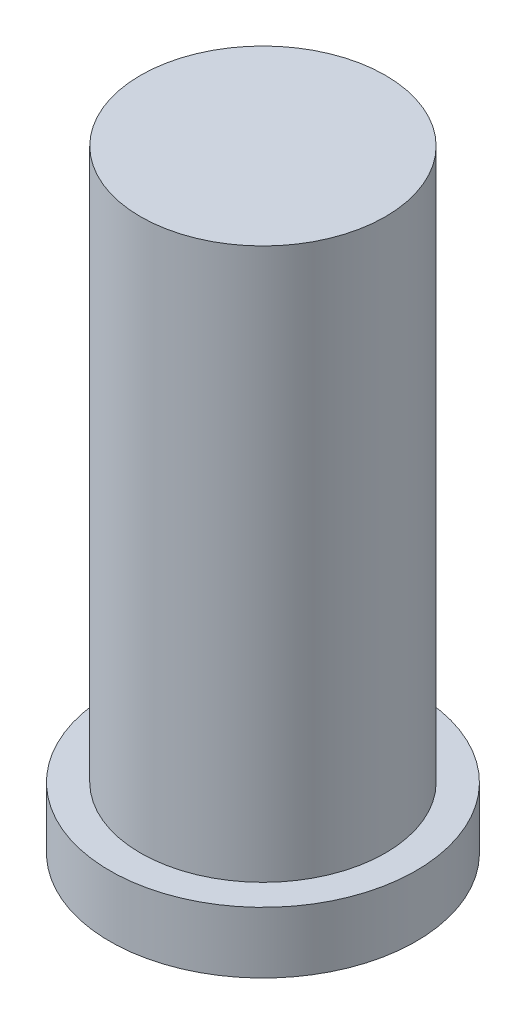
ISO-10303-21;
HEADER;
FILE_DESCRIPTION(('STEP AP214'),'2;1');
FILE_NAME('part.step','',(''),(''),'','','');
FILE_SCHEMA(('AUTOMOTIVE_DESIGN { 1 0 10303 214 1 1 1 1 }'));
ENDSEC;
DATA;
#1=APPLICATION_CONTEXT('core data for automotive mechanical design processes');
#2=APPLICATION_PROTOCOL_DEFINITION('international standard','automotive_design',2000,#1);
#3=PRODUCT_CONTEXT('',#1,'mechanical');
#4=PRODUCT('Part','Part','',(#3));
#5=PRODUCT_RELATED_PRODUCT_CATEGORY('part','',(#4));
#6=PRODUCT_DEFINITION_FORMATION('','',#4);
#7=PRODUCT_DEFINITION_CONTEXT('part definition',#1,'design');
#8=PRODUCT_DEFINITION('design','',#6,#7);
#9=PRODUCT_DEFINITION_SHAPE('','',#8);
#10=(LENGTH_UNIT() NAMED_UNIT(*) SI_UNIT(.MILLI.,.METRE.));
#11=(NAMED_UNIT(*) PLANE_ANGLE_UNIT() SI_UNIT($,.RADIAN.));
#12=(NAMED_UNIT(*) SI_UNIT($,.STERADIAN.) SOLID_ANGLE_UNIT());
#13=UNCERTAINTY_MEASURE_WITH_UNIT(LENGTH_MEASURE(1.E-05),#10,'distance_accuracy_value','');
#14=(GEOMETRIC_REPRESENTATION_CONTEXT(3) GLOBAL_UNCERTAINTY_ASSIGNED_CONTEXT((#13)) GLOBAL_UNIT_ASSIGNED_CONTEXT((#10,
#11,#12)) REPRESENTATION_CONTEXT('',''));
#15=CARTESIAN_POINT('',(0.,0.,0.));
#16=DIRECTION('',(0.,0.,1.));
#17=DIRECTION('',(1.,0.,0.));
#18=AXIS2_PLACEMENT_3D('',#15,#16,#17);
#19=CARTESIAN_POINT('',(0.,18.,0.));
#20=DIRECTION('',(0.,-1.,0.));
#21=DIRECTION('',(0.,0.,-1.));
#22=AXIS2_PLACEMENT_3D('',#19,#20,#21);
#23=CYLINDRICAL_SURFACE('',#22,4.);
#24=CARTESIAN_POINT('',(0.,18.,0.));
#25=DIRECTION('',(0.,1.,0.));
#26=DIRECTION('',(0.,0.,1.));
#27=AXIS2_PLACEMENT_3D('',#24,#25,#26);
#28=CIRCLE('',#27,4.);
#29=CARTESIAN_POINT('',(0.,18.,4.));
#30=VERTEX_POINT('',#29);
#31=EDGE_CURVE('E10',#30,#30,#28,.T.);
#32=ORIENTED_EDGE('',*,*,#31,.F.);
#33=EDGE_LOOP('',(#32));
#34=FACE_BOUND('',#33,.T.);
#35=CARTESIAN_POINT('',(0.,0.,0.));
#36=DIRECTION('',(0.,1.,0.));
#37=DIRECTION('',(0.,0.,1.));
#38=AXIS2_PLACEMENT_3D('',#35,#36,#37);
#39=CIRCLE('',#38,4.);
#40=CARTESIAN_POINT('',(0.,0.,4.));
#41=VERTEX_POINT('',#40);
#42=EDGE_CURVE('E40',#41,#41,#39,.T.);
#43=ORIENTED_EDGE('',*,*,#42,.T.);
#44=EDGE_LOOP('',(#43));
#45=FACE_BOUND('',#44,.T.);
#46=ADVANCED_FACE('F37',(#34,#45),#23,.T.);
#47=CARTESIAN_POINT('',(0.,18.,0.));
#48=DIRECTION('',(0.,1.,0.));
#49=DIRECTION('',(0.,0.,1.));
#50=AXIS2_PLACEMENT_3D('',#47,#48,#49);
#51=PLANE('',#50);
#52=ORIENTED_EDGE('',*,*,#31,.T.);
#53=EDGE_LOOP('',(#52));
#54=FACE_BOUND('',#53,.T.);
#55=ADVANCED_FACE('F64',(#54),#51,.T.);
#56=CARTESIAN_POINT('',(0.,-2.,0.));
#57=DIRECTION('',(0.,1.,0.));
#58=DIRECTION('',(0.,0.,1.));
#59=AXIS2_PLACEMENT_3D('',#56,#57,#58);
#60=CYLINDRICAL_SURFACE('',#59,5.);
#61=CARTESIAN_POINT('',(0.,-2.,0.));
#62=DIRECTION('',(0.,-1.,0.));
#63=DIRECTION('',(0.,0.,-1.));
#64=AXIS2_PLACEMENT_3D('',#61,#62,#63);
#65=CIRCLE('',#64,5.);
#66=CARTESIAN_POINT('',(0.,-2.,-5.));
#67=VERTEX_POINT('',#66);
#68=EDGE_CURVE('E49',#67,#67,#65,.T.);
#69=ORIENTED_EDGE('',*,*,#68,.F.);
#70=EDGE_LOOP('',(#69));
#71=FACE_BOUND('',#70,.T.);
#72=CARTESIAN_POINT('',(0.,0.,0.));
#73=DIRECTION('',(0.,-1.,0.));
#74=DIRECTION('',(0.,0.,-1.));
#75=AXIS2_PLACEMENT_3D('',#72,#73,#74);
#76=CIRCLE('',#75,5.);
#77=CARTESIAN_POINT('',(0.,0.,-5.));
#78=VERTEX_POINT('',#77);
#79=EDGE_CURVE('E51',#78,#78,#76,.T.);
#80=ORIENTED_EDGE('',*,*,#79,.T.);
#81=EDGE_LOOP('',(#80));
#82=FACE_BOUND('',#81,.T.);
#83=ADVANCED_FACE('F61',(#71,#82),#60,.T.);
#84=CARTESIAN_POINT('',(0.,-2.,0.));
#85=DIRECTION('',(0.,-1.,0.));
#86=DIRECTION('',(0.,0.,-1.));
#87=AXIS2_PLACEMENT_3D('',#84,#85,#86);
#88=PLANE('',#87);
#89=ORIENTED_EDGE('',*,*,#68,.T.);
#90=EDGE_LOOP('',(#89));
#91=FACE_BOUND('',#90,.T.);
#92=ADVANCED_FACE('F59',(#91),#88,.T.);
#93=CARTESIAN_POINT('',(0.,0.,0.));
#94=DIRECTION('',(0.,-1.,0.));
#95=DIRECTION('',(0.,0.,-1.));
#96=AXIS2_PLACEMENT_3D('',#93,#94,#95);
#97=PLANE('',#96);
#98=ORIENTED_EDGE('',*,*,#42,.F.);
#99=EDGE_LOOP('',(#98));
#100=FACE_BOUND('',#99,.T.);
#101=ORIENTED_EDGE('',*,*,#79,.F.);
#102=EDGE_LOOP('',(#101));
#103=FACE_BOUND('',#102,.T.);
#104=ADVANCED_FACE('F68',(#100,#103),#97,.F.);
#105=CLOSED_SHELL('',(#46,#55,#83,#92,#104));
#106=MANIFOLD_SOLID_BREP('B2',#105);
#107=ADVANCED_BREP_SHAPE_REPRESENTATION('',(#18,#106),#14);
#108=SHAPE_DEFINITION_REPRESENTATION(#9,#107);
ENDSEC;
END-ISO-10303-21;
